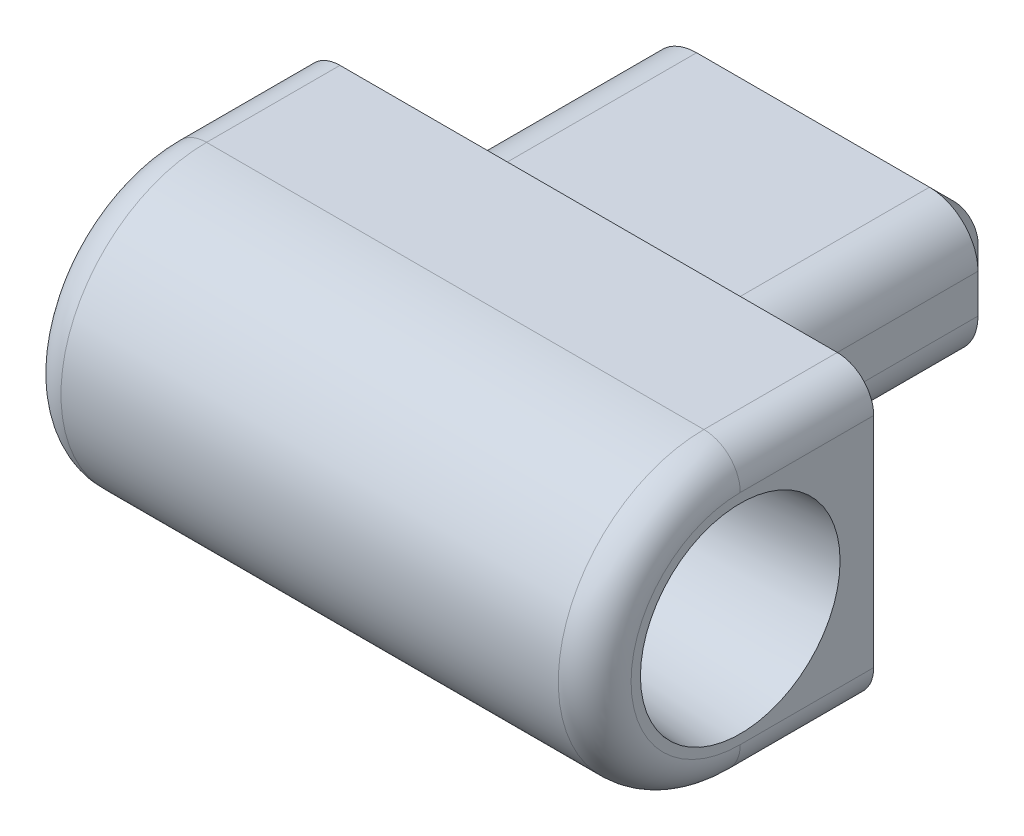
ISO-10303-21;
HEADER;
FILE_DESCRIPTION(('STEP AP214'),'2;1');
FILE_NAME('part.step','',(''),(''),'','','');
FILE_SCHEMA(('AUTOMOTIVE_DESIGN { 1 0 10303 214 1 1 1 1 }'));
ENDSEC;
DATA;
#1=APPLICATION_CONTEXT('core data for automotive mechanical design processes');
#2=APPLICATION_PROTOCOL_DEFINITION('international standard','automotive_design',2000,#1);
#3=PRODUCT_CONTEXT('',#1,'mechanical');
#4=PRODUCT('Part','Part','',(#3));
#5=PRODUCT_RELATED_PRODUCT_CATEGORY('part','',(#4));
#6=PRODUCT_DEFINITION_FORMATION('','',#4);
#7=PRODUCT_DEFINITION_CONTEXT('part definition',#1,'design');
#8=PRODUCT_DEFINITION('design','',#6,#7);
#9=PRODUCT_DEFINITION_SHAPE('','',#8);
#10=(LENGTH_UNIT() NAMED_UNIT(*) SI_UNIT(.MILLI.,.METRE.));
#11=(NAMED_UNIT(*) PLANE_ANGLE_UNIT() SI_UNIT($,.RADIAN.));
#12=(NAMED_UNIT(*) SI_UNIT($,.STERADIAN.) SOLID_ANGLE_UNIT());
#13=UNCERTAINTY_MEASURE_WITH_UNIT(LENGTH_MEASURE(1.E-05),#10,'distance_accuracy_value','');
#14=(GEOMETRIC_REPRESENTATION_CONTEXT(3) GLOBAL_UNCERTAINTY_ASSIGNED_CONTEXT((#13)) GLOBAL_UNIT_ASSIGNED_CONTEXT((#10,
#11,#12)) REPRESENTATION_CONTEXT('',''));
#15=CARTESIAN_POINT('',(0.,0.,0.));
#16=DIRECTION('',(0.,0.,1.));
#17=DIRECTION('',(1.,0.,0.));
#18=AXIS2_PLACEMENT_3D('',#15,#16,#17);
#19=CARTESIAN_POINT('',(-42.5,-3.,0.));
#20=DIRECTION('',(0.,0.,1.));
#21=DIRECTION('',(1.,0.,0.));
#22=AXIS2_PLACEMENT_3D('',#19,#20,#21);
#23=PLANE('',#22);
#24=DIRECTION('',(0.,-1.,0.));
#25=VECTOR('',#24,1.);
#26=CARTESIAN_POINT('',(-30.75,-3.,0.));
#27=LINE('',#26,#25);
#28=CARTESIAN_POINT('',(-30.75,2.25,0.));
#29=VERTEX_POINT('',#28);
#30=CARTESIAN_POINT('',(-30.75,-2.25,0.));
#31=VERTEX_POINT('',#30);
#32=EDGE_CURVE('E239',#29,#31,#27,.T.);
#33=ORIENTED_EDGE('',*,*,#32,.T.);
#34=CARTESIAN_POINT('',(-31.5,-2.25,0.));
#35=DIRECTION('',(0.,0.,1.));
#36=DIRECTION('',(1.,0.,0.));
#37=AXIS2_PLACEMENT_3D('',#34,#35,#36);
#38=CIRCLE('',#37,0.75);
#39=CARTESIAN_POINT('',(-31.5,-3.,0.));
#40=VERTEX_POINT('',#39);
#41=EDGE_CURVE('E334',#31,#40,#38,.F.);
#42=ORIENTED_EDGE('',*,*,#41,.T.);
#43=DIRECTION('',(1.,0.,0.));
#44=VECTOR('',#43,1.);
#45=CARTESIAN_POINT('',(-42.5,-3.,0.));
#46=LINE('',#45,#44);
#47=CARTESIAN_POINT('',(-41.75,-3.,0.));
#48=VERTEX_POINT('',#47);
#49=EDGE_CURVE('E248',#48,#40,#46,.T.);
#50=ORIENTED_EDGE('',*,*,#49,.F.);
#51=CARTESIAN_POINT('',(-41.75,-2.25,0.));
#52=DIRECTION('',(0.,0.,1.));
#53=DIRECTION('',(1.,0.,0.));
#54=AXIS2_PLACEMENT_3D('',#51,#52,#53);
#55=CIRCLE('',#54,0.75);
#56=CARTESIAN_POINT('',(-42.5,-2.25,0.));
#57=VERTEX_POINT('',#56);
#58=EDGE_CURVE('E330',#48,#57,#55,.F.);
#59=ORIENTED_EDGE('',*,*,#58,.T.);
#60=DIRECTION('',(0.,-1.,0.));
#61=VECTOR('',#60,1.);
#62=CARTESIAN_POINT('',(-42.5,-3.,0.));
#63=LINE('',#62,#61);
#64=CARTESIAN_POINT('',(-42.5,2.25,0.));
#65=VERTEX_POINT('',#64);
#66=EDGE_CURVE('E240',#65,#57,#63,.T.);
#67=ORIENTED_EDGE('',*,*,#66,.F.);
#68=CARTESIAN_POINT('',(-41.75,2.25,0.));
#69=DIRECTION('',(0.,0.,1.));
#70=DIRECTION('',(1.,0.,0.));
#71=AXIS2_PLACEMENT_3D('',#68,#69,#70);
#72=CIRCLE('',#71,0.75);
#73=CARTESIAN_POINT('',(-41.75,3.,0.));
#74=VERTEX_POINT('',#73);
#75=EDGE_CURVE('E328',#65,#74,#72,.F.);
#76=ORIENTED_EDGE('',*,*,#75,.T.);
#77=DIRECTION('',(1.,0.,0.));
#78=VECTOR('',#77,1.);
#79=CARTESIAN_POINT('',(-42.5,3.,0.));
#80=LINE('',#79,#78);
#81=CARTESIAN_POINT('',(-31.5,3.,0.));
#82=VERTEX_POINT('',#81);
#83=EDGE_CURVE('E251',#74,#82,#80,.T.);
#84=ORIENTED_EDGE('',*,*,#83,.T.);
#85=CARTESIAN_POINT('',(-31.5,2.25,0.));
#86=DIRECTION('',(0.,0.,1.));
#87=DIRECTION('',(1.,0.,0.));
#88=AXIS2_PLACEMENT_3D('',#85,#86,#87);
#89=CIRCLE('',#88,0.75);
#90=EDGE_CURVE('E332',#82,#29,#89,.F.);
#91=ORIENTED_EDGE('',*,*,#90,.T.);
#92=EDGE_LOOP('',(#33,#42,#50,#59,#67,#76,#84,#91));
#93=FACE_BOUND('',#92,.T.);
#94=CARTESIAN_POINT('',(-35.1,0.4,0.));
#95=DIRECTION('',(0.,0.,-1.));
#96=DIRECTION('',(-1.,0.,0.));
#97=AXIS2_PLACEMENT_3D('',#94,#95,#96);
#98=CIRCLE('',#97,1.);
#99=CARTESIAN_POINT('',(-35.1,1.4,0.));
#100=VERTEX_POINT('',#99);
#101=CARTESIAN_POINT('',(-34.1,0.399999999999992,0.));
#102=VERTEX_POINT('',#101);
#103=EDGE_CURVE('E208',#100,#102,#98,.T.);
#104=ORIENTED_EDGE('',*,*,#103,.F.);
#105=DIRECTION('',(1.,0.,0.));
#106=VECTOR('',#105,1.);
#107=CARTESIAN_POINT('',(-35.1,1.4,0.));
#108=LINE('',#107,#106);
#109=CARTESIAN_POINT('',(-39.9,1.4,0.));
#110=VERTEX_POINT('',#109);
#111=EDGE_CURVE('E224',#110,#100,#108,.T.);
#112=ORIENTED_EDGE('',*,*,#111,.F.);
#113=CARTESIAN_POINT('',(-39.9,0.4,0.));
#114=DIRECTION('',(0.,0.,-1.));
#115=DIRECTION('',(1.,0.,0.));
#116=AXIS2_PLACEMENT_3D('',#113,#114,#115);
#117=CIRCLE('',#116,1.);
#118=CARTESIAN_POINT('',(-40.9,0.399999999999993,0.));
#119=VERTEX_POINT('',#118);
#120=EDGE_CURVE('E221',#119,#110,#117,.T.);
#121=ORIENTED_EDGE('',*,*,#120,.F.);
#122=DIRECTION('',(0.,1.,0.));
#123=VECTOR('',#122,1.);
#124=CARTESIAN_POINT('',(-40.9,0.399999999999992,0.));
#125=LINE('',#124,#123);
#126=CARTESIAN_POINT('',(-40.9,-0.399999999999992,0.));
#127=VERTEX_POINT('',#126);
#128=EDGE_CURVE('E218',#127,#119,#125,.T.);
#129=ORIENTED_EDGE('',*,*,#128,.F.);
#130=CARTESIAN_POINT('',(-39.9,-0.4,0.));
#131=DIRECTION('',(0.,0.,-1.));
#132=DIRECTION('',(-1.,0.,0.));
#133=AXIS2_PLACEMENT_3D('',#130,#131,#132);
#134=CIRCLE('',#133,1.);
#135=CARTESIAN_POINT('',(-39.9,-1.4,0.));
#136=VERTEX_POINT('',#135);
#137=EDGE_CURVE('E215',#136,#127,#134,.T.);
#138=ORIENTED_EDGE('',*,*,#137,.F.);
#139=DIRECTION('',(-1.,0.,0.));
#140=VECTOR('',#139,1.);
#141=CARTESIAN_POINT('',(-35.1,-1.4,0.));
#142=LINE('',#141,#140);
#143=CARTESIAN_POINT('',(-35.1,-1.4,0.));
#144=VERTEX_POINT('',#143);
#145=EDGE_CURVE('E204',#144,#136,#142,.T.);
#146=ORIENTED_EDGE('',*,*,#145,.F.);
#147=CARTESIAN_POINT('',(-35.1,-0.4,0.));
#148=DIRECTION('',(0.,0.,-1.));
#149=DIRECTION('',(-1.,0.,0.));
#150=AXIS2_PLACEMENT_3D('',#147,#148,#149);
#151=CIRCLE('',#150,1.);
#152=CARTESIAN_POINT('',(-34.1,-0.399999999999993,0.));
#153=VERTEX_POINT('',#152);
#154=EDGE_CURVE('E187',#153,#144,#151,.T.);
#155=ORIENTED_EDGE('',*,*,#154,.F.);
#156=DIRECTION('',(0.,-1.,0.));
#157=VECTOR('',#156,1.);
#158=CARTESIAN_POINT('',(-34.1,0.399999999999992,0.));
#159=LINE('',#158,#157);
#160=EDGE_CURVE('E200',#102,#153,#159,.T.);
#161=ORIENTED_EDGE('',*,*,#160,.F.);
#162=EDGE_LOOP('',(#104,#112,#121,#129,#138,#146,#155,#161));
#163=FACE_BOUND('',#162,.T.);
#164=ADVANCED_FACE('F43',(#93,#163),#23,.F.);
#165=CARTESIAN_POINT('',(-42.5,0.,2.75));
#166=DIRECTION('',(1.,0.,0.));
#167=DIRECTION('',(0.,0.,-1.));
#168=AXIS2_PLACEMENT_3D('',#165,#166,#167);
#169=CYLINDRICAL_SURFACE('',#168,3.);
#170=DIRECTION('',(1.,0.,0.));
#171=VECTOR('',#170,1.);
#172=CARTESIAN_POINT('',(-42.5,-3.,2.75));
#173=LINE('',#172,#171);
#174=CARTESIAN_POINT('',(-41.75,-3.,2.75));
#175=VERTEX_POINT('',#174);
#176=CARTESIAN_POINT('',(-31.5,-3.,2.75));
#177=VERTEX_POINT('',#176);
#178=EDGE_CURVE('E243',#175,#177,#173,.T.);
#179=ORIENTED_EDGE('',*,*,#178,.T.);
#180=CARTESIAN_POINT('',(-31.5,0.,2.75));
#181=DIRECTION('',(1.,0.,0.));
#182=DIRECTION('',(0.,0.,-1.));
#183=AXIS2_PLACEMENT_3D('',#180,#181,#182);
#184=CIRCLE('',#183,3.);
#185=CARTESIAN_POINT('',(-31.5,3.,2.75));
#186=VERTEX_POINT('',#185);
#187=EDGE_CURVE('E11',#177,#186,#184,.F.);
#188=ORIENTED_EDGE('',*,*,#187,.T.);
#189=DIRECTION('',(1.,0.,0.));
#190=VECTOR('',#189,1.);
#191=CARTESIAN_POINT('',(-42.5,3.,2.75));
#192=LINE('',#191,#190);
#193=CARTESIAN_POINT('',(-41.75,3.,2.75));
#194=VERTEX_POINT('',#193);
#195=EDGE_CURVE('E254',#194,#186,#192,.T.);
#196=ORIENTED_EDGE('',*,*,#195,.F.);
#197=CARTESIAN_POINT('',(-41.75,0.,2.75));
#198=DIRECTION('',(1.,0.,0.));
#199=DIRECTION('',(0.,0.,-1.));
#200=AXIS2_PLACEMENT_3D('',#197,#198,#199);
#201=CIRCLE('',#200,3.);
#202=EDGE_CURVE('E52',#194,#175,#201,.T.);
#203=ORIENTED_EDGE('',*,*,#202,.T.);
#204=EDGE_LOOP('',(#179,#188,#196,#203));
#205=FACE_BOUND('',#204,.T.);
#206=ADVANCED_FACE('F372',(#205),#169,.T.);
#207=CARTESIAN_POINT('',(-42.5,3.,0.));
#208=DIRECTION('',(0.,-1.,0.));
#209=DIRECTION('',(0.,0.,-1.));
#210=AXIS2_PLACEMENT_3D('',#207,#208,#209);
#211=PLANE('',#210);
#212=ORIENTED_EDGE('',*,*,#195,.T.);
#213=DIRECTION('',(0.,0.,-1.));
#214=VECTOR('',#213,1.);
#215=CARTESIAN_POINT('',(-31.5,3.,0.));
#216=LINE('',#215,#214);
#217=EDGE_CURVE('E338',#186,#82,#216,.T.);
#218=ORIENTED_EDGE('',*,*,#217,.T.);
#219=ORIENTED_EDGE('',*,*,#83,.F.);
#220=DIRECTION('',(0.,0.,-1.));
#221=VECTOR('',#220,1.);
#222=CARTESIAN_POINT('',(-41.75,3.,0.));
#223=LINE('',#222,#221);
#224=EDGE_CURVE('E336',#74,#194,#223,.F.);
#225=ORIENTED_EDGE('',*,*,#224,.T.);
#226=EDGE_LOOP('',(#212,#218,#219,#225));
#227=FACE_BOUND('',#226,.T.);
#228=ADVANCED_FACE('F377',(#227),#211,.F.);
#229=CARTESIAN_POINT('',(-42.5,-3.,2.75));
#230=DIRECTION('',(0.,1.,0.));
#231=DIRECTION('',(0.,0.,1.));
#232=AXIS2_PLACEMENT_3D('',#229,#230,#231);
#233=PLANE('',#232);
#234=ORIENTED_EDGE('',*,*,#49,.T.);
#235=DIRECTION('',(0.,0.,1.));
#236=VECTOR('',#235,1.);
#237=CARTESIAN_POINT('',(-31.5,-3.,2.75));
#238=LINE('',#237,#236);
#239=EDGE_CURVE('E319',#40,#177,#238,.T.);
#240=ORIENTED_EDGE('',*,*,#239,.T.);
#241=ORIENTED_EDGE('',*,*,#178,.F.);
#242=DIRECTION('',(0.,0.,1.));
#243=VECTOR('',#242,1.);
#244=CARTESIAN_POINT('',(-41.75,-3.,2.75));
#245=LINE('',#244,#243);
#246=EDGE_CURVE('E290',#175,#48,#245,.F.);
#247=ORIENTED_EDGE('',*,*,#246,.T.);
#248=EDGE_LOOP('',(#234,#240,#241,#247));
#249=FACE_BOUND('',#248,.T.);
#250=ADVANCED_FACE('F369',(#249),#233,.F.);
#251=CARTESIAN_POINT('',(-42.5,0.,2.75));
#252=DIRECTION('',(1.,0.,0.));
#253=DIRECTION('',(0.,0.,-1.));
#254=AXIS2_PLACEMENT_3D('',#251,#252,#253);
#255=PLANE('',#254);
#256=ORIENTED_EDGE('',*,*,#66,.T.);
#257=DIRECTION('',(0.,0.,1.));
#258=VECTOR('',#257,1.);
#259=CARTESIAN_POINT('',(-42.5,-2.25,2.75));
#260=LINE('',#259,#258);
#261=CARTESIAN_POINT('',(-42.5,-2.25,2.75));
#262=VERTEX_POINT('',#261);
#263=EDGE_CURVE('E343',#57,#262,#260,.T.);
#264=ORIENTED_EDGE('',*,*,#263,.T.);
#265=CARTESIAN_POINT('',(-42.5,0.,2.75));
#266=DIRECTION('',(1.,0.,0.));
#267=DIRECTION('',(0.,0.,-1.));
#268=AXIS2_PLACEMENT_3D('',#265,#266,#267);
#269=CIRCLE('',#268,2.25);
#270=CARTESIAN_POINT('',(-42.5,2.25,2.75));
#271=VERTEX_POINT('',#270);
#272=EDGE_CURVE('E60',#262,#271,#269,.F.);
#273=ORIENTED_EDGE('',*,*,#272,.T.);
#274=DIRECTION('',(0.,0.,-1.));
#275=VECTOR('',#274,1.);
#276=CARTESIAN_POINT('',(-42.5,2.25,2.75));
#277=LINE('',#276,#275);
#278=EDGE_CURVE('E341',#271,#65,#277,.T.);
#279=ORIENTED_EDGE('',*,*,#278,.T.);
#280=EDGE_LOOP('',(#256,#264,#273,#279));
#281=FACE_BOUND('',#280,.T.);
#282=CARTESIAN_POINT('',(-42.5,0.,2.75));
#283=DIRECTION('',(-1.,0.,0.));
#284=DIRECTION('',(0.,0.,1.));
#285=AXIS2_PLACEMENT_3D('',#282,#283,#284);
#286=CIRCLE('',#285,1.375);
#287=CARTESIAN_POINT('',(-42.5,0.,4.125));
#288=VERTEX_POINT('',#287);
#289=EDGE_CURVE('E350',#288,#288,#286,.T.);
#290=ORIENTED_EDGE('',*,*,#289,.F.);
#291=EDGE_LOOP('',(#290));
#292=FACE_BOUND('',#291,.T.);
#293=ADVANCED_FACE('F360',(#281,#292),#255,.F.);
#294=CARTESIAN_POINT('',(-30.75,0.,2.75));
#295=DIRECTION('',(1.,0.,0.));
#296=DIRECTION('',(0.,0.,-1.));
#297=AXIS2_PLACEMENT_3D('',#294,#295,#296);
#298=PLANE('',#297);
#299=CARTESIAN_POINT('',(-30.75,0.,2.75));
#300=DIRECTION('',(1.,0.,0.));
#301=DIRECTION('',(0.,0.,-1.));
#302=AXIS2_PLACEMENT_3D('',#299,#300,#301);
#303=CIRCLE('',#302,2.0574);
#304=CARTESIAN_POINT('',(-30.75,0.,0.6926));
#305=VERTEX_POINT('',#304);
#306=EDGE_CURVE('E316',#305,#305,#303,.T.);
#307=ORIENTED_EDGE('',*,*,#306,.F.);
#308=EDGE_LOOP('',(#307));
#309=FACE_BOUND('',#308,.T.);
#310=CARTESIAN_POINT('',(-30.75,0.,2.75));
#311=DIRECTION('',(1.,0.,0.));
#312=DIRECTION('',(0.,0.,-1.));
#313=AXIS2_PLACEMENT_3D('',#310,#311,#312);
#314=CIRCLE('',#313,2.25);
#315=CARTESIAN_POINT('',(-30.75,2.25,2.75));
#316=VERTEX_POINT('',#315);
#317=CARTESIAN_POINT('',(-30.75,-2.25,2.75));
#318=VERTEX_POINT('',#317);
#319=EDGE_CURVE('E322',#316,#318,#314,.T.);
#320=ORIENTED_EDGE('',*,*,#319,.T.);
#321=DIRECTION('',(0.,0.,1.));
#322=VECTOR('',#321,1.);
#323=CARTESIAN_POINT('',(-30.75,-2.25,0.));
#324=LINE('',#323,#322);
#325=EDGE_CURVE('E326',#318,#31,#324,.F.);
#326=ORIENTED_EDGE('',*,*,#325,.T.);
#327=ORIENTED_EDGE('',*,*,#32,.F.);
#328=DIRECTION('',(0.,0.,-1.));
#329=VECTOR('',#328,1.);
#330=CARTESIAN_POINT('',(-30.75,2.25,2.75));
#331=LINE('',#330,#329);
#332=EDGE_CURVE('E324',#29,#316,#331,.F.);
#333=ORIENTED_EDGE('',*,*,#332,.T.);
#334=EDGE_LOOP('',(#320,#326,#327,#333));
#335=FACE_BOUND('',#334,.T.);
#336=ADVANCED_FACE('F389',(#309,#335),#298,.T.);
#337=CARTESIAN_POINT('',(-35.1,0.4,-6.));
#338=DIRECTION('',(0.,0.,1.));
#339=DIRECTION('',(1.,0.,0.));
#340=AXIS2_PLACEMENT_3D('',#337,#338,#339);
#341=CYLINDRICAL_SURFACE('',#340,1.);
#342=DIRECTION('',(0.,0.,1.));
#343=VECTOR('',#342,1.);
#344=CARTESIAN_POINT('',(-34.1,0.399999999999992,-6.));
#345=LINE('',#344,#343);
#346=CARTESIAN_POINT('',(-34.1,0.399999999999992,-5.5));
#347=VERTEX_POINT('',#346);
#348=EDGE_CURVE('E193',#347,#102,#345,.T.);
#349=ORIENTED_EDGE('',*,*,#348,.F.);
#350=CARTESIAN_POINT('',(-35.1,0.4,-5.5));
#351=DIRECTION('',(0.,0.,-1.));
#352=DIRECTION('',(-1.,0.,0.));
#353=AXIS2_PLACEMENT_3D('',#350,#351,#352);
#354=CIRCLE('',#353,1.);
#355=CARTESIAN_POINT('',(-35.1,1.4,-5.5));
#356=VERTEX_POINT('',#355);
#357=EDGE_CURVE('E288',#347,#356,#354,.F.);
#358=ORIENTED_EDGE('',*,*,#357,.T.);
#359=DIRECTION('',(0.,0.,1.));
#360=VECTOR('',#359,1.);
#361=CARTESIAN_POINT('',(-35.1,1.4,-6.));
#362=LINE('',#361,#360);
#363=EDGE_CURVE('E227',#356,#100,#362,.T.);
#364=ORIENTED_EDGE('',*,*,#363,.T.);
#365=ORIENTED_EDGE('',*,*,#103,.T.);
#366=EDGE_LOOP('',(#349,#358,#364,#365));
#367=FACE_BOUND('',#366,.T.);
#368=ADVANCED_FACE('F485',(#367),#341,.T.);
#369=CARTESIAN_POINT('',(-34.1,0.399999999999992,-6.));
#370=DIRECTION('',(-1.,0.,0.));
#371=DIRECTION('',(0.,0.,1.));
#372=AXIS2_PLACEMENT_3D('',#369,#370,#371);
#373=PLANE('',#372);
#374=DIRECTION('',(0.,0.,1.));
#375=VECTOR('',#374,1.);
#376=CARTESIAN_POINT('',(-34.1,-0.399999999999993,-6.));
#377=LINE('',#376,#375);
#378=CARTESIAN_POINT('',(-34.1,-0.399999999999993,-5.5));
#379=VERTEX_POINT('',#378);
#380=EDGE_CURVE('E183',#379,#153,#377,.T.);
#381=ORIENTED_EDGE('',*,*,#380,.F.);
#382=DIRECTION('',(0.,1.,0.));
#383=VECTOR('',#382,1.);
#384=CARTESIAN_POINT('',(-34.1,0.399999999999992,-5.5));
#385=LINE('',#384,#383);
#386=EDGE_CURVE('E286',#379,#347,#385,.T.);
#387=ORIENTED_EDGE('',*,*,#386,.T.);
#388=ORIENTED_EDGE('',*,*,#348,.T.);
#389=ORIENTED_EDGE('',*,*,#160,.T.);
#390=EDGE_LOOP('',(#381,#387,#388,#389));
#391=FACE_BOUND('',#390,.T.);
#392=ADVANCED_FACE('F206',(#391),#373,.F.);
#393=CARTESIAN_POINT('',(-35.1,-0.4,-6.));
#394=DIRECTION('',(0.,0.,1.));
#395=DIRECTION('',(1.,0.,0.));
#396=AXIS2_PLACEMENT_3D('',#393,#394,#395);
#397=CYLINDRICAL_SURFACE('',#396,1.);
#398=DIRECTION('',(0.,0.,1.));
#399=VECTOR('',#398,1.);
#400=CARTESIAN_POINT('',(-35.1,-1.4,-6.));
#401=LINE('',#400,#399);
#402=CARTESIAN_POINT('',(-35.1,-1.4,-5.5));
#403=VERTEX_POINT('',#402);
#404=EDGE_CURVE('E194',#403,#144,#401,.T.);
#405=ORIENTED_EDGE('',*,*,#404,.F.);
#406=CARTESIAN_POINT('',(-35.1,-0.4,-5.5));
#407=DIRECTION('',(0.,0.,-1.));
#408=DIRECTION('',(-1.,0.,0.));
#409=AXIS2_PLACEMENT_3D('',#406,#407,#408);
#410=CIRCLE('',#409,1.);
#411=EDGE_CURVE('E189',#403,#379,#410,.F.);
#412=ORIENTED_EDGE('',*,*,#411,.T.);
#413=ORIENTED_EDGE('',*,*,#380,.T.);
#414=ORIENTED_EDGE('',*,*,#154,.T.);
#415=EDGE_LOOP('',(#405,#412,#413,#414));
#416=FACE_BOUND('',#415,.T.);
#417=ADVANCED_FACE('F186',(#416),#397,.T.);
#418=CARTESIAN_POINT('',(-35.1,-1.4,-6.));
#419=DIRECTION('',(0.,1.,0.));
#420=DIRECTION('',(0.,0.,1.));
#421=AXIS2_PLACEMENT_3D('',#418,#419,#420);
#422=PLANE('',#421);
#423=DIRECTION('',(0.,0.,1.));
#424=VECTOR('',#423,1.);
#425=CARTESIAN_POINT('',(-39.9,-1.4,-6.));
#426=LINE('',#425,#424);
#427=CARTESIAN_POINT('',(-39.9,-1.4,-5.5));
#428=VERTEX_POINT('',#427);
#429=EDGE_CURVE('E235',#428,#136,#426,.T.);
#430=ORIENTED_EDGE('',*,*,#429,.F.);
#431=DIRECTION('',(1.,0.,0.));
#432=VECTOR('',#431,1.);
#433=CARTESIAN_POINT('',(-35.1,-1.4,-5.5));
#434=LINE('',#433,#432);
#435=EDGE_CURVE('E283',#428,#403,#434,.T.);
#436=ORIENTED_EDGE('',*,*,#435,.T.);
#437=ORIENTED_EDGE('',*,*,#404,.T.);
#438=ORIENTED_EDGE('',*,*,#145,.T.);
#439=EDGE_LOOP('',(#430,#436,#437,#438));
#440=FACE_BOUND('',#439,.T.);
#441=ADVANCED_FACE('F515',(#440),#422,.F.);
#442=CARTESIAN_POINT('',(-39.9,-0.4,-6.));
#443=DIRECTION('',(0.,0.,1.));
#444=DIRECTION('',(1.,0.,0.));
#445=AXIS2_PLACEMENT_3D('',#442,#443,#444);
#446=CYLINDRICAL_SURFACE('',#445,1.);
#447=DIRECTION('',(0.,0.,1.));
#448=VECTOR('',#447,1.);
#449=CARTESIAN_POINT('',(-40.9,-0.399999999999992,-6.));
#450=LINE('',#449,#448);
#451=CARTESIAN_POINT('',(-40.9,-0.399999999999992,-5.5));
#452=VERTEX_POINT('',#451);
#453=EDGE_CURVE('E233',#452,#127,#450,.T.);
#454=ORIENTED_EDGE('',*,*,#453,.F.);
#455=CARTESIAN_POINT('',(-39.9,-0.4,-5.5));
#456=DIRECTION('',(0.,0.,-1.));
#457=DIRECTION('',(-1.,0.,0.));
#458=AXIS2_PLACEMENT_3D('',#455,#456,#457);
#459=CIRCLE('',#458,1.);
#460=EDGE_CURVE('E281',#452,#428,#459,.F.);
#461=ORIENTED_EDGE('',*,*,#460,.T.);
#462=ORIENTED_EDGE('',*,*,#429,.T.);
#463=ORIENTED_EDGE('',*,*,#137,.T.);
#464=EDGE_LOOP('',(#454,#461,#462,#463));
#465=FACE_BOUND('',#464,.T.);
#466=ADVANCED_FACE('F503',(#465),#446,.T.);
#467=CARTESIAN_POINT('',(-40.9,0.399999999999992,-6.));
#468=DIRECTION('',(1.,0.,0.));
#469=DIRECTION('',(0.,0.,-1.));
#470=AXIS2_PLACEMENT_3D('',#467,#468,#469);
#471=PLANE('',#470);
#472=DIRECTION('',(0.,0.,1.));
#473=VECTOR('',#472,1.);
#474=CARTESIAN_POINT('',(-40.9,0.399999999999993,-6.));
#475=LINE('',#474,#473);
#476=CARTESIAN_POINT('',(-40.9,0.399999999999993,-5.5));
#477=VERTEX_POINT('',#476);
#478=EDGE_CURVE('E231',#477,#119,#475,.T.);
#479=ORIENTED_EDGE('',*,*,#478,.F.);
#480=DIRECTION('',(0.,-1.,0.));
#481=VECTOR('',#480,1.);
#482=CARTESIAN_POINT('',(-40.9,-0.399999999999992,-5.5));
#483=LINE('',#482,#481);
#484=EDGE_CURVE('E279',#477,#452,#483,.T.);
#485=ORIENTED_EDGE('',*,*,#484,.T.);
#486=ORIENTED_EDGE('',*,*,#453,.T.);
#487=ORIENTED_EDGE('',*,*,#128,.T.);
#488=EDGE_LOOP('',(#479,#485,#486,#487));
#489=FACE_BOUND('',#488,.T.);
#490=ADVANCED_FACE('F498',(#489),#471,.F.);
#491=CARTESIAN_POINT('',(-39.9,0.4,-6.));
#492=DIRECTION('',(0.,0.,1.));
#493=DIRECTION('',(1.,0.,0.));
#494=AXIS2_PLACEMENT_3D('',#491,#492,#493);
#495=CYLINDRICAL_SURFACE('',#494,1.);
#496=DIRECTION('',(0.,0.,1.));
#497=VECTOR('',#496,1.);
#498=CARTESIAN_POINT('',(-39.9,1.4,-6.));
#499=LINE('',#498,#497);
#500=CARTESIAN_POINT('',(-39.9,1.4,-5.5));
#501=VERTEX_POINT('',#500);
#502=EDGE_CURVE('E229',#501,#110,#499,.T.);
#503=ORIENTED_EDGE('',*,*,#502,.F.);
#504=CARTESIAN_POINT('',(-39.9,0.4,-5.5));
#505=DIRECTION('',(0.,0.,-1.));
#506=DIRECTION('',(-1.,0.,0.));
#507=AXIS2_PLACEMENT_3D('',#504,#505,#506);
#508=CIRCLE('',#507,1.);
#509=EDGE_CURVE('E277',#501,#477,#508,.F.);
#510=ORIENTED_EDGE('',*,*,#509,.T.);
#511=ORIENTED_EDGE('',*,*,#478,.T.);
#512=ORIENTED_EDGE('',*,*,#120,.T.);
#513=EDGE_LOOP('',(#503,#510,#511,#512));
#514=FACE_BOUND('',#513,.T.);
#515=ADVANCED_FACE('F493',(#514),#495,.T.);
#516=CARTESIAN_POINT('',(-35.1,1.4,-6.));
#517=DIRECTION('',(0.,-1.,0.));
#518=DIRECTION('',(0.,0.,-1.));
#519=AXIS2_PLACEMENT_3D('',#516,#517,#518);
#520=PLANE('',#519);
#521=ORIENTED_EDGE('',*,*,#363,.F.);
#522=DIRECTION('',(-1.,0.,0.));
#523=VECTOR('',#522,1.);
#524=CARTESIAN_POINT('',(-39.9,1.4,-5.5));
#525=LINE('',#524,#523);
#526=EDGE_CURVE('E274',#356,#501,#525,.T.);
#527=ORIENTED_EDGE('',*,*,#526,.T.);
#528=ORIENTED_EDGE('',*,*,#502,.T.);
#529=ORIENTED_EDGE('',*,*,#111,.T.);
#530=EDGE_LOOP('',(#521,#527,#528,#529));
#531=FACE_BOUND('',#530,.T.);
#532=ADVANCED_FACE('F472',(#531),#520,.F.);
#533=CARTESIAN_POINT('',(-35.1,0.4,-6.));
#534=DIRECTION('',(0.,0.,-1.));
#535=DIRECTION('',(-1.,0.,0.));
#536=AXIS2_PLACEMENT_3D('',#533,#534,#535);
#537=PLANE('',#536);
#538=CARTESIAN_POINT('',(-39.9,0.4,-6.));
#539=DIRECTION('',(0.,0.,-1.));
#540=DIRECTION('',(-1.,0.,0.));
#541=AXIS2_PLACEMENT_3D('',#538,#539,#540);
#542=CIRCLE('',#541,0.5);
#543=CARTESIAN_POINT('',(-40.4,0.399999999999996,-6.));
#544=VERTEX_POINT('',#543);
#545=CARTESIAN_POINT('',(-39.9,0.9,-6.));
#546=VERTEX_POINT('',#545);
#547=EDGE_CURVE('E269',#544,#546,#542,.T.);
#548=ORIENTED_EDGE('',*,*,#547,.T.);
#549=DIRECTION('',(1.,0.,0.));
#550=VECTOR('',#549,1.);
#551=CARTESIAN_POINT('',(-35.1,0.899999999999999,-6.));
#552=LINE('',#551,#550);
#553=CARTESIAN_POINT('',(-35.1,0.9,-6.));
#554=VERTEX_POINT('',#553);
#555=EDGE_CURVE('E271',#546,#554,#552,.T.);
#556=ORIENTED_EDGE('',*,*,#555,.T.);
#557=CARTESIAN_POINT('',(-35.1,0.4,-6.));
#558=DIRECTION('',(0.,0.,-1.));
#559=DIRECTION('',(-1.,0.,0.));
#560=AXIS2_PLACEMENT_3D('',#557,#558,#559);
#561=CIRCLE('',#560,0.5);
#562=CARTESIAN_POINT('',(-34.6,0.399999999999992,-6.));
#563=VERTEX_POINT('',#562);
#564=EDGE_CURVE('E257',#554,#563,#561,.T.);
#565=ORIENTED_EDGE('',*,*,#564,.T.);
#566=DIRECTION('',(0.,-1.,0.));
#567=VECTOR('',#566,1.);
#568=CARTESIAN_POINT('',(-34.6,-0.399999999999993,-6.));
#569=LINE('',#568,#567);
#570=CARTESIAN_POINT('',(-34.6,-0.399999999999996,-6.));
#571=VERTEX_POINT('',#570);
#572=EDGE_CURVE('E259',#563,#571,#569,.T.);
#573=ORIENTED_EDGE('',*,*,#572,.T.);
#574=CARTESIAN_POINT('',(-35.1,-0.4,-6.));
#575=DIRECTION('',(0.,0.,-1.));
#576=DIRECTION('',(-1.,0.,0.));
#577=AXIS2_PLACEMENT_3D('',#574,#575,#576);
#578=CIRCLE('',#577,0.5);
#579=CARTESIAN_POINT('',(-35.1,-0.9,-6.));
#580=VERTEX_POINT('',#579);
#581=EDGE_CURVE('E261',#571,#580,#578,.T.);
#582=ORIENTED_EDGE('',*,*,#581,.T.);
#583=DIRECTION('',(-1.,0.,0.));
#584=VECTOR('',#583,1.);
#585=CARTESIAN_POINT('',(-39.9,-0.899999999999999,-6.));
#586=LINE('',#585,#584);
#587=CARTESIAN_POINT('',(-39.9,-0.899999999999999,-6.));
#588=VERTEX_POINT('',#587);
#589=EDGE_CURVE('E263',#580,#588,#586,.T.);
#590=ORIENTED_EDGE('',*,*,#589,.T.);
#591=CARTESIAN_POINT('',(-39.9,-0.4,-6.));
#592=DIRECTION('',(0.,0.,-1.));
#593=DIRECTION('',(-1.,0.,0.));
#594=AXIS2_PLACEMENT_3D('',#591,#592,#593);
#595=CIRCLE('',#594,0.5);
#596=CARTESIAN_POINT('',(-40.4,-0.399999999999992,-6.));
#597=VERTEX_POINT('',#596);
#598=EDGE_CURVE('E265',#588,#597,#595,.T.);
#599=ORIENTED_EDGE('',*,*,#598,.T.);
#600=DIRECTION('',(0.,1.,0.));
#601=VECTOR('',#600,1.);
#602=CARTESIAN_POINT('',(-40.4,0.399999999999993,-6.));
#603=LINE('',#602,#601);
#604=EDGE_CURVE('E267',#597,#544,#603,.T.);
#605=ORIENTED_EDGE('',*,*,#604,.T.);
#606=EDGE_LOOP('',(#548,#556,#565,#573,#582,#590,#599,#605));
#607=FACE_BOUND('',#606,.T.);
#608=ADVANCED_FACE('F467',(#607),#537,.T.);
#609=CARTESIAN_POINT('',(-35.1,-0.899999999999999,-6.));
#610=DIRECTION('',(0.,-0.707106781186549,-0.707106781186546));
#611=DIRECTION('',(1.,0.,0.));
#612=AXIS2_PLACEMENT_3D('',#609,#610,#611);
#613=PLANE('',#612);
#614=DIRECTION('',(0.,0.707106781186546,-0.707106781186549));
#615=VECTOR('',#614,1.);
#616=CARTESIAN_POINT('',(-35.1,-1.4,-5.5));
#617=LINE('',#616,#615);
#618=EDGE_CURVE('E308',#403,#580,#617,.T.);
#619=ORIENTED_EDGE('',*,*,#618,.F.);
#620=ORIENTED_EDGE('',*,*,#435,.F.);
#621=DIRECTION('',(0.,-0.707106781186546,0.707106781186549));
#622=VECTOR('',#621,1.);
#623=CARTESIAN_POINT('',(-39.9,-0.899999999999999,-6.));
#624=LINE('',#623,#622);
#625=EDGE_CURVE('E210',#588,#428,#624,.T.);
#626=ORIENTED_EDGE('',*,*,#625,.F.);
#627=ORIENTED_EDGE('',*,*,#589,.F.);
#628=EDGE_LOOP('',(#619,#620,#626,#627));
#629=FACE_BOUND('',#628,.T.);
#630=ADVANCED_FACE('F462',(#629),#613,.T.);
#631=CARTESIAN_POINT('',(-39.9,-0.4,-6.));
#632=DIRECTION('',(0.,0.,1.));
#633=DIRECTION('',(1.,0.,0.));
#634=AXIS2_PLACEMENT_3D('',#631,#632,#633);
#635=CONICAL_SURFACE('',#634,0.5,0.785398163397446);
#636=ORIENTED_EDGE('',*,*,#625,.T.);
#637=ORIENTED_EDGE('',*,*,#460,.F.);
#638=DIRECTION('',(-0.707106781186546,0.,0.707106781186549));
#639=VECTOR('',#638,1.);
#640=CARTESIAN_POINT('',(-40.4,-0.399999999999992,-6.));
#641=LINE('',#640,#639);
#642=EDGE_CURVE('E305',#597,#452,#641,.T.);
#643=ORIENTED_EDGE('',*,*,#642,.F.);
#644=ORIENTED_EDGE('',*,*,#598,.F.);
#645=EDGE_LOOP('',(#636,#637,#643,#644));
#646=FACE_BOUND('',#645,.T.);
#647=ADVANCED_FACE('F456',(#646),#635,.T.);
#648=CARTESIAN_POINT('',(-35.1,-0.4,-6.));
#649=DIRECTION('',(0.,0.,1.));
#650=DIRECTION('',(1.,0.,0.));
#651=AXIS2_PLACEMENT_3D('',#648,#649,#650);
#652=CONICAL_SURFACE('',#651,0.5,0.785398163397446);
#653=ORIENTED_EDGE('',*,*,#618,.T.);
#654=ORIENTED_EDGE('',*,*,#581,.F.);
#655=DIRECTION('',(-0.707106781186546,0.,-0.707106781186549));
#656=VECTOR('',#655,1.);
#657=CARTESIAN_POINT('',(-34.1,-0.399999999999993,-5.5));
#658=LINE('',#657,#656);
#659=EDGE_CURVE('E302',#379,#571,#658,.T.);
#660=ORIENTED_EDGE('',*,*,#659,.F.);
#661=ORIENTED_EDGE('',*,*,#411,.F.);
#662=EDGE_LOOP('',(#653,#654,#660,#661));
#663=FACE_BOUND('',#662,.T.);
#664=ADVANCED_FACE('F449',(#663),#652,.T.);
#665=CARTESIAN_POINT('',(-40.4,0.4,-6.));
#666=DIRECTION('',(-0.707106781186549,0.,-0.707106781186546));
#667=DIRECTION('',(0.,-1.,0.));
#668=AXIS2_PLACEMENT_3D('',#665,#666,#667);
#669=PLANE('',#668);
#670=ORIENTED_EDGE('',*,*,#642,.T.);
#671=ORIENTED_EDGE('',*,*,#484,.F.);
#672=DIRECTION('',(-0.707106781186546,0.,0.707106781186549));
#673=VECTOR('',#672,1.);
#674=CARTESIAN_POINT('',(-40.4,0.399999999999996,-6.));
#675=LINE('',#674,#673);
#676=EDGE_CURVE('E299',#544,#477,#675,.T.);
#677=ORIENTED_EDGE('',*,*,#676,.F.);
#678=ORIENTED_EDGE('',*,*,#604,.F.);
#679=EDGE_LOOP('',(#670,#671,#677,#678));
#680=FACE_BOUND('',#679,.T.);
#681=ADVANCED_FACE('F442',(#680),#669,.T.);
#682=CARTESIAN_POINT('',(-34.6,0.4,-6.));
#683=DIRECTION('',(0.707106781186549,0.,-0.707106781186546));
#684=DIRECTION('',(0.,1.,0.));
#685=AXIS2_PLACEMENT_3D('',#682,#683,#684);
#686=PLANE('',#685);
#687=ORIENTED_EDGE('',*,*,#659,.T.);
#688=ORIENTED_EDGE('',*,*,#572,.F.);
#689=DIRECTION('',(-0.707106781186546,0.,-0.707106781186549));
#690=VECTOR('',#689,1.);
#691=CARTESIAN_POINT('',(-34.1,0.399999999999992,-5.5));
#692=LINE('',#691,#690);
#693=EDGE_CURVE('E296',#347,#563,#692,.T.);
#694=ORIENTED_EDGE('',*,*,#693,.F.);
#695=ORIENTED_EDGE('',*,*,#386,.F.);
#696=EDGE_LOOP('',(#687,#688,#694,#695));
#697=FACE_BOUND('',#696,.T.);
#698=ADVANCED_FACE('F435',(#697),#686,.T.);
#699=CARTESIAN_POINT('',(-39.9,0.4,-6.));
#700=DIRECTION('',(0.,0.,1.));
#701=DIRECTION('',(1.,0.,0.));
#702=AXIS2_PLACEMENT_3D('',#699,#700,#701);
#703=CONICAL_SURFACE('',#702,0.5,0.785398163397446);
#704=ORIENTED_EDGE('',*,*,#676,.T.);
#705=ORIENTED_EDGE('',*,*,#509,.F.);
#706=DIRECTION('',(0.,0.707106781186546,0.707106781186549));
#707=VECTOR('',#706,1.);
#708=CARTESIAN_POINT('',(-39.9,0.9,-6.));
#709=LINE('',#708,#707);
#710=EDGE_CURVE('E293',#546,#501,#709,.T.);
#711=ORIENTED_EDGE('',*,*,#710,.F.);
#712=ORIENTED_EDGE('',*,*,#547,.F.);
#713=EDGE_LOOP('',(#704,#705,#711,#712));
#714=FACE_BOUND('',#713,.T.);
#715=ADVANCED_FACE('F428',(#714),#703,.T.);
#716=CARTESIAN_POINT('',(-35.1,0.4,-6.));
#717=DIRECTION('',(0.,0.,1.));
#718=DIRECTION('',(1.,0.,0.));
#719=AXIS2_PLACEMENT_3D('',#716,#717,#718);
#720=CONICAL_SURFACE('',#719,0.5,0.785398163397446);
#721=ORIENTED_EDGE('',*,*,#693,.T.);
#722=ORIENTED_EDGE('',*,*,#564,.F.);
#723=DIRECTION('',(0.,-0.707106781186546,-0.707106781186549));
#724=VECTOR('',#723,1.);
#725=CARTESIAN_POINT('',(-35.1,1.4,-5.5));
#726=LINE('',#725,#724);
#727=EDGE_CURVE('E291',#356,#554,#726,.T.);
#728=ORIENTED_EDGE('',*,*,#727,.F.);
#729=ORIENTED_EDGE('',*,*,#357,.F.);
#730=EDGE_LOOP('',(#721,#722,#728,#729));
#731=FACE_BOUND('',#730,.T.);
#732=ADVANCED_FACE('F421',(#731),#720,.T.);
#733=CARTESIAN_POINT('',(-35.1,0.899999999999999,-6.));
#734=DIRECTION('',(0.,0.707106781186549,-0.707106781186546));
#735=DIRECTION('',(-1.,0.,0.));
#736=AXIS2_PLACEMENT_3D('',#733,#734,#735);
#737=PLANE('',#736);
#738=ORIENTED_EDGE('',*,*,#710,.T.);
#739=ORIENTED_EDGE('',*,*,#526,.F.);
#740=ORIENTED_EDGE('',*,*,#727,.T.);
#741=ORIENTED_EDGE('',*,*,#555,.F.);
#742=EDGE_LOOP('',(#738,#739,#740,#741));
#743=FACE_BOUND('',#742,.T.);
#744=ADVANCED_FACE('F414',(#743),#737,.T.);
#745=CARTESIAN_POINT('',(-37.75,0.,2.75));
#746=DIRECTION('',(1.,0.,0.));
#747=DIRECTION('',(0.,0.,-1.));
#748=AXIS2_PLACEMENT_3D('',#745,#746,#747);
#749=CONICAL_SURFACE('',#748,1.786001,1.02974425867665);
#750=CARTESIAN_POINT('',(-38.0119758307566,0.,2.75));
#751=DIRECTION('',(1.,0.,0.));
#752=DIRECTION('',(0.,0.,-1.));
#753=AXIS2_PLACEMENT_3D('',#750,#751,#752);
#754=CIRCLE('',#753,1.35);
#755=CARTESIAN_POINT('',(-38.0119758307566,0.,1.4));
#756=VERTEX_POINT('',#755);
#757=EDGE_CURVE('E313',#756,#756,#754,.F.);
#758=ORIENTED_EDGE('',*,*,#757,.T.);
#759=EDGE_LOOP('',(#758));
#760=FACE_BOUND('',#759,.T.);
#761=CARTESIAN_POINT('',(-37.75,0.,2.75));
#762=DIRECTION('',(1.,0.,0.));
#763=DIRECTION('',(0.,0.,-1.));
#764=AXIS2_PLACEMENT_3D('',#761,#762,#763);
#765=CIRCLE('',#764,1.786001);
#766=CARTESIAN_POINT('',(-37.75,0.,0.963999000000002));
#767=VERTEX_POINT('',#766);
#768=EDGE_CURVE('E294',#767,#767,#765,.T.);
#769=ORIENTED_EDGE('',*,*,#768,.T.);
#770=EDGE_LOOP('',(#769));
#771=FACE_BOUND('',#770,.T.);
#772=ADVANCED_FACE('F420',(#760,#771),#749,.F.);
#773=CARTESIAN_POINT('',(-30.75,0.,2.75));
#774=DIRECTION('',(1.,0.,0.));
#775=DIRECTION('',(0.,0.,-1.));
#776=AXIS2_PLACEMENT_3D('',#773,#774,#775);
#777=CYLINDRICAL_SURFACE('',#776,1.786001);
#778=ORIENTED_EDGE('',*,*,#768,.F.);
#779=EDGE_LOOP('',(#778));
#780=FACE_BOUND('',#779,.T.);
#781=CARTESIAN_POINT('',(-34.6311865214054,0.,2.75));
#782=DIRECTION('',(1.,0.,0.));
#783=DIRECTION('',(0.,0.,-1.));
#784=AXIS2_PLACEMENT_3D('',#781,#782,#783);
#785=CIRCLE('',#784,1.786001);
#786=CARTESIAN_POINT('',(-34.6311865214054,0.,0.963999));
#787=VERTEX_POINT('',#786);
#788=EDGE_CURVE('E538',#787,#787,#785,.T.);
#789=ORIENTED_EDGE('',*,*,#788,.T.);
#790=EDGE_LOOP('',(#789));
#791=FACE_BOUND('',#790,.T.);
#792=ADVANCED_FACE('F548',(#780,#791),#777,.F.);
#793=CARTESIAN_POINT('',(-30.75,0.,2.75));
#794=DIRECTION('',(1.,0.,0.));
#795=DIRECTION('',(0.,0.,-1.));
#796=AXIS2_PLACEMENT_3D('',#793,#794,#795);
#797=CONICAL_SURFACE('',#796,2.0574,0.069813170079773);
#798=ORIENTED_EDGE('',*,*,#788,.F.);
#799=EDGE_LOOP('',(#798));
#800=FACE_BOUND('',#799,.T.);
#801=ORIENTED_EDGE('',*,*,#306,.T.);
#802=EDGE_LOOP('',(#801));
#803=FACE_BOUND('',#802,.T.);
#804=ADVANCED_FACE('F551',(#800,#803),#797,.F.);
#805=CARTESIAN_POINT('',(-42.5,0.,2.75));
#806=DIRECTION('',(-1.,0.,0.));
#807=DIRECTION('',(0.,0.,1.));
#808=AXIS2_PLACEMENT_3D('',#805,#806,#807);
#809=CYLINDRICAL_SURFACE('',#808,1.35);
#810=CARTESIAN_POINT('',(-42.475,0.,2.75));
#811=DIRECTION('',(-1.,0.,0.));
#812=DIRECTION('',(0.,0.,1.));
#813=AXIS2_PLACEMENT_3D('',#810,#811,#812);
#814=CIRCLE('',#813,1.35);
#815=CARTESIAN_POINT('',(-42.475,0.,4.1));
#816=VERTEX_POINT('',#815);
#817=EDGE_CURVE('E317',#816,#816,#814,.T.);
#818=ORIENTED_EDGE('',*,*,#817,.T.);
#819=EDGE_LOOP('',(#818));
#820=FACE_BOUND('',#819,.T.);
#821=ORIENTED_EDGE('',*,*,#757,.F.);
#822=EDGE_LOOP('',(#821));
#823=FACE_BOUND('',#822,.T.);
#824=ADVANCED_FACE('F556',(#820,#823),#809,.F.);
#825=CARTESIAN_POINT('',(-42.5,0.,2.75));
#826=DIRECTION('',(-1.,0.,0.));
#827=DIRECTION('',(0.,0.,1.));
#828=AXIS2_PLACEMENT_3D('',#825,#826,#827);
#829=CONICAL_SURFACE('',#828,1.375,0.785398163397518);
#830=ORIENTED_EDGE('',*,*,#817,.F.);
#831=EDGE_LOOP('',(#830));
#832=FACE_BOUND('',#831,.T.);
#833=ORIENTED_EDGE('',*,*,#289,.T.);
#834=EDGE_LOOP('',(#833));
#835=FACE_BOUND('',#834,.T.);
#836=ADVANCED_FACE('F561',(#832,#835),#829,.F.);
#837=CARTESIAN_POINT('',(-31.5,2.25,0.));
#838=DIRECTION('',(0.,0.,1.));
#839=DIRECTION('',(0.,-1.,0.));
#840=AXIS2_PLACEMENT_3D('',#837,#838,#839);
#841=CYLINDRICAL_SURFACE('',#840,0.75);
#842=ORIENTED_EDGE('',*,*,#90,.F.);
#843=ORIENTED_EDGE('',*,*,#217,.F.);
#844=CARTESIAN_POINT('',(-31.5,2.25,2.75));
#845=DIRECTION('',(0.,0.,1.));
#846=DIRECTION('',(1.,0.,0.));
#847=AXIS2_PLACEMENT_3D('',#844,#845,#846);
#848=CIRCLE('',#847,0.75);
#849=EDGE_CURVE('E348',#316,#186,#848,.T.);
#850=ORIENTED_EDGE('',*,*,#849,.F.);
#851=ORIENTED_EDGE('',*,*,#332,.F.);
#852=EDGE_LOOP('',(#842,#843,#850,#851));
#853=FACE_BOUND('',#852,.T.);
#854=ADVANCED_FACE('F381',(#853),#841,.T.);
#855=CARTESIAN_POINT('',(-31.5,0.,2.75));
#856=DIRECTION('',(1.,0.,0.));
#857=DIRECTION('',(0.,0.,-1.));
#858=AXIS2_PLACEMENT_3D('',#855,#856,#857);
#859=TOROIDAL_SURFACE('',#858,2.25,0.75);
#860=ORIENTED_EDGE('',*,*,#849,.T.);
#861=ORIENTED_EDGE('',*,*,#187,.F.);
#862=CARTESIAN_POINT('',(-31.5,-2.25,2.75));
#863=DIRECTION('',(0.,0.,-1.));
#864=DIRECTION('',(-1.,0.,0.));
#865=AXIS2_PLACEMENT_3D('',#862,#863,#864);
#866=CIRCLE('',#865,0.75);
#867=EDGE_CURVE('E346',#318,#177,#866,.T.);
#868=ORIENTED_EDGE('',*,*,#867,.F.);
#869=ORIENTED_EDGE('',*,*,#319,.F.);
#870=EDGE_LOOP('',(#860,#861,#868,#869));
#871=FACE_BOUND('',#870,.T.);
#872=ADVANCED_FACE('F385',(#871),#859,.T.);
#873=CARTESIAN_POINT('',(-31.5,-2.25,2.75));
#874=DIRECTION('',(0.,0.,-1.));
#875=DIRECTION('',(0.,1.,0.));
#876=AXIS2_PLACEMENT_3D('',#873,#874,#875);
#877=CYLINDRICAL_SURFACE('',#876,0.75);
#878=ORIENTED_EDGE('',*,*,#41,.F.);
#879=ORIENTED_EDGE('',*,*,#325,.F.);
#880=ORIENTED_EDGE('',*,*,#867,.T.);
#881=ORIENTED_EDGE('',*,*,#239,.F.);
#882=EDGE_LOOP('',(#878,#879,#880,#881));
#883=FACE_BOUND('',#882,.T.);
#884=ADVANCED_FACE('F393',(#883),#877,.T.);
#885=CARTESIAN_POINT('',(-41.75,2.25,2.75));
#886=DIRECTION('',(0.,0.,-1.));
#887=DIRECTION('',(0.,1.,0.));
#888=AXIS2_PLACEMENT_3D('',#885,#886,#887);
#889=CYLINDRICAL_SURFACE('',#888,0.75);
#890=ORIENTED_EDGE('',*,*,#75,.F.);
#891=ORIENTED_EDGE('',*,*,#278,.F.);
#892=CARTESIAN_POINT('',(-41.75,2.25,2.75));
#893=DIRECTION('',(0.,0.,1.));
#894=DIRECTION('',(1.,0.,0.));
#895=AXIS2_PLACEMENT_3D('',#892,#893,#894);
#896=CIRCLE('',#895,0.75);
#897=EDGE_CURVE('E47',#194,#271,#896,.T.);
#898=ORIENTED_EDGE('',*,*,#897,.F.);
#899=ORIENTED_EDGE('',*,*,#224,.F.);
#900=EDGE_LOOP('',(#890,#891,#898,#899));
#901=FACE_BOUND('',#900,.T.);
#902=ADVANCED_FACE('F45',(#901),#889,.T.);
#903=CARTESIAN_POINT('',(-41.75,0.,2.75));
#904=DIRECTION('',(1.,0.,0.));
#905=DIRECTION('',(0.,0.,-1.));
#906=AXIS2_PLACEMENT_3D('',#903,#904,#905);
#907=TOROIDAL_SURFACE('',#906,2.25,0.75);
#908=ORIENTED_EDGE('',*,*,#897,.T.);
#909=ORIENTED_EDGE('',*,*,#272,.F.);
#910=CARTESIAN_POINT('',(-41.75,-2.25,2.75));
#911=DIRECTION('',(0.,0.,-1.));
#912=DIRECTION('',(-1.,0.,0.));
#913=AXIS2_PLACEMENT_3D('',#910,#911,#912);
#914=CIRCLE('',#913,0.75);
#915=EDGE_CURVE('E68',#175,#262,#914,.T.);
#916=ORIENTED_EDGE('',*,*,#915,.F.);
#917=ORIENTED_EDGE('',*,*,#202,.F.);
#918=EDGE_LOOP('',(#908,#909,#916,#917));
#919=FACE_BOUND('',#918,.T.);
#920=ADVANCED_FACE('F355',(#919),#907,.T.);
#921=CARTESIAN_POINT('',(-41.75,-2.25,2.75));
#922=DIRECTION('',(0.,0.,1.));
#923=DIRECTION('',(0.,-1.,0.));
#924=AXIS2_PLACEMENT_3D('',#921,#922,#923);
#925=CYLINDRICAL_SURFACE('',#924,0.75);
#926=ORIENTED_EDGE('',*,*,#58,.F.);
#927=ORIENTED_EDGE('',*,*,#246,.F.);
#928=ORIENTED_EDGE('',*,*,#915,.T.);
#929=ORIENTED_EDGE('',*,*,#263,.F.);
#930=EDGE_LOOP('',(#926,#927,#928,#929));
#931=FACE_BOUND('',#930,.T.);
#932=ADVANCED_FACE('F366',(#931),#925,.T.);
#933=CLOSED_SHELL('',(#164,#206,#228,#250,#293,#336,#368,#392,#417,#441,#466,#490,#515,#532,
#608,#630,#647,#664,#681,#698,#715,#732,#744,#772,#792,#804,#824,#836,#854,#872,#884,#902,#920,#932));
#934=MANIFOLD_SOLID_BREP('B2',#933);
#935=ADVANCED_BREP_SHAPE_REPRESENTATION('',(#18,#934),#14);
#936=SHAPE_DEFINITION_REPRESENTATION(#9,#935);
ENDSEC;
END-ISO-10303-21;
